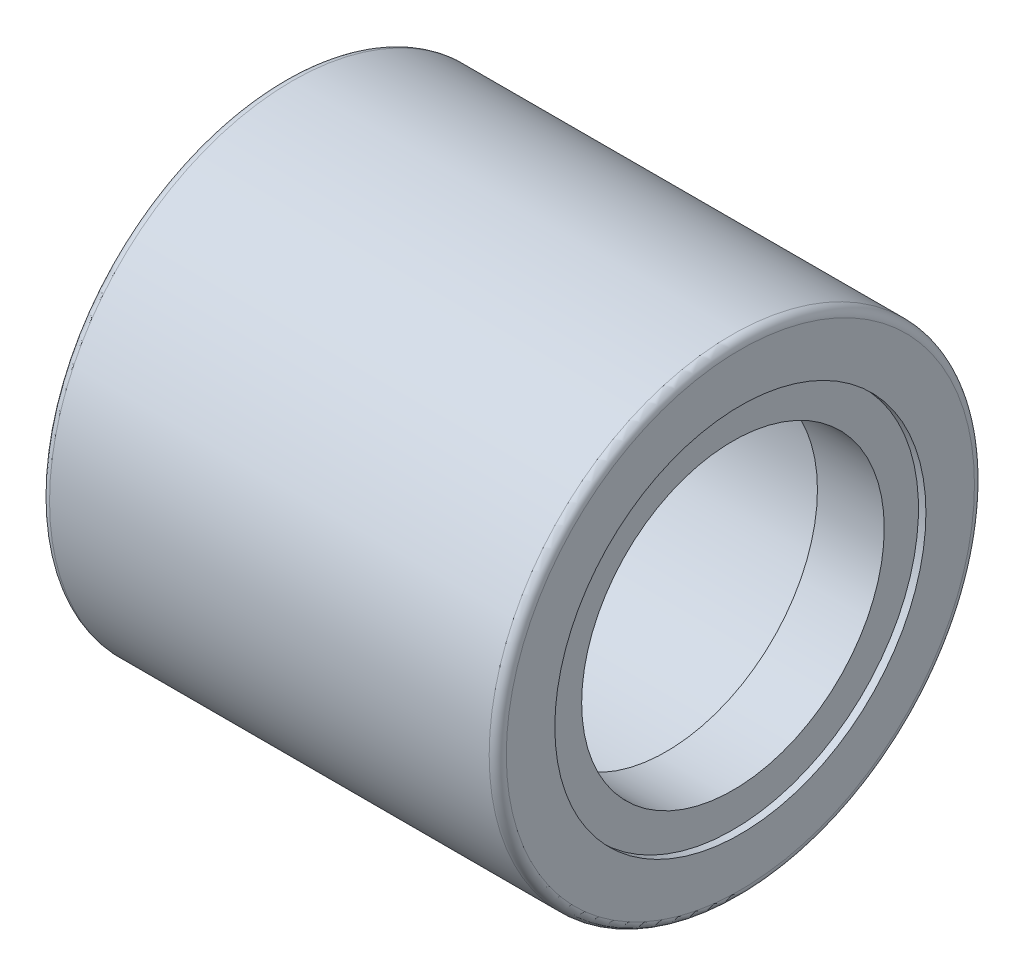
ISO-10303-21;
HEADER;
FILE_DESCRIPTION(('STEP AP214'),'2;1');
FILE_NAME('part.step','',(''),(''),'','','');
FILE_SCHEMA(('AUTOMOTIVE_DESIGN { 1 0 10303 214 1 1 1 1 }'));
ENDSEC;
DATA;
#1=APPLICATION_CONTEXT('core data for automotive mechanical design processes');
#2=APPLICATION_PROTOCOL_DEFINITION('international standard','automotive_design',2000,#1);
#3=PRODUCT_CONTEXT('',#1,'mechanical');
#4=PRODUCT('Part','Part','',(#3));
#5=PRODUCT_RELATED_PRODUCT_CATEGORY('part','',(#4));
#6=PRODUCT_DEFINITION_FORMATION('','',#4);
#7=PRODUCT_DEFINITION_CONTEXT('part definition',#1,'design');
#8=PRODUCT_DEFINITION('design','',#6,#7);
#9=PRODUCT_DEFINITION_SHAPE('','',#8);
#10=(LENGTH_UNIT() NAMED_UNIT(*) SI_UNIT(.MILLI.,.METRE.));
#11=(NAMED_UNIT(*) PLANE_ANGLE_UNIT() SI_UNIT($,.RADIAN.));
#12=(NAMED_UNIT(*) SI_UNIT($,.STERADIAN.) SOLID_ANGLE_UNIT());
#13=UNCERTAINTY_MEASURE_WITH_UNIT(LENGTH_MEASURE(1.E-05),#10,'distance_accuracy_value','');
#14=(GEOMETRIC_REPRESENTATION_CONTEXT(3) GLOBAL_UNCERTAINTY_ASSIGNED_CONTEXT((#13)) GLOBAL_UNIT_ASSIGNED_CONTEXT((#10,
#11,#12)) REPRESENTATION_CONTEXT('',''));
#15=CARTESIAN_POINT('',(0.,0.,0.));
#16=DIRECTION('',(0.,0.,1.));
#17=DIRECTION('',(1.,0.,0.));
#18=AXIS2_PLACEMENT_3D('',#15,#16,#17);
#19=CARTESIAN_POINT('',(0.,-8.42405645280223,-8.2));
#20=DIRECTION('',(-1.,0.,0.));
#21=DIRECTION('',(0.,0.,1.));
#22=AXIS2_PLACEMENT_3D('',#19,#20,#21);
#23=PLANE('',#22);
#24=CARTESIAN_POINT('',(0.,0.,0.));
#25=DIRECTION('',(-1.,0.,0.));
#26=DIRECTION('',(0.,0.,-1.));
#27=AXIS2_PLACEMENT_3D('',#24,#25,#26);
#28=CIRCLE('',#27,8.2);
#29=CARTESIAN_POINT('',(0.,0.,-8.2));
#30=VERTEX_POINT('',#29);
#31=EDGE_CURVE('E62',#30,#30,#28,.F.);
#32=ORIENTED_EDGE('',*,*,#31,.F.);
#33=EDGE_LOOP('',(#32));
#34=FACE_BOUND('',#33,.T.);
#35=CARTESIAN_POINT('',(0.,0.,0.));
#36=DIRECTION('',(1.,0.,0.));
#37=DIRECTION('',(0.,0.,1.));
#38=AXIS2_PLACEMENT_3D('',#35,#36,#37);
#39=CIRCLE('',#38,6.5);
#40=CARTESIAN_POINT('',(0.,0.,6.5));
#41=VERTEX_POINT('',#40);
#42=EDGE_CURVE('E59',#41,#41,#39,.T.);
#43=ORIENTED_EDGE('',*,*,#42,.T.);
#44=EDGE_LOOP('',(#43));
#45=FACE_BOUND('',#44,.T.);
#46=ADVANCED_FACE('F15',(#34,#45),#23,.T.);
#47=CARTESIAN_POINT('',(16.,-8.42405645280222,8.2));
#48=DIRECTION('',(1.,0.,0.));
#49=DIRECTION('',(0.,0.,-1.));
#50=AXIS2_PLACEMENT_3D('',#47,#48,#49);
#51=PLANE('',#50);
#52=CARTESIAN_POINT('',(16.,0.,0.));
#53=DIRECTION('',(1.,0.,0.));
#54=DIRECTION('',(0.,0.,1.));
#55=AXIS2_PLACEMENT_3D('',#52,#53,#54);
#56=CIRCLE('',#55,8.2);
#57=CARTESIAN_POINT('',(16.,0.,8.2));
#58=VERTEX_POINT('',#57);
#59=EDGE_CURVE('E56',#58,#58,#56,.T.);
#60=ORIENTED_EDGE('',*,*,#59,.T.);
#61=EDGE_LOOP('',(#60));
#62=FACE_BOUND('',#61,.T.);
#63=CARTESIAN_POINT('',(16.,0.,0.));
#64=DIRECTION('',(-1.,0.,0.));
#65=DIRECTION('',(0.,0.,-1.));
#66=AXIS2_PLACEMENT_3D('',#63,#64,#65);
#67=CIRCLE('',#66,6.5);
#68=CARTESIAN_POINT('',(16.,0.,-6.5));
#69=VERTEX_POINT('',#68);
#70=EDGE_CURVE('E53',#69,#69,#67,.F.);
#71=ORIENTED_EDGE('',*,*,#70,.F.);
#72=EDGE_LOOP('',(#71));
#73=FACE_BOUND('',#72,.T.);
#74=ADVANCED_FACE('F71',(#62,#73),#51,.T.);
#75=CARTESIAN_POINT('',(0.26,-6.67760572478225,-6.5));
#76=DIRECTION('',(-1.,0.,0.));
#77=DIRECTION('',(0.,0.,1.));
#78=AXIS2_PLACEMENT_3D('',#75,#76,#77);
#79=PLANE('',#78);
#80=CARTESIAN_POINT('',(0.26,0.,0.));
#81=DIRECTION('',(-1.,0.,0.));
#82=DIRECTION('',(0.,0.,-1.));
#83=AXIS2_PLACEMENT_3D('',#80,#81,#82);
#84=CIRCLE('',#83,6.5);
#85=CARTESIAN_POINT('',(0.26,0.,-6.5));
#86=VERTEX_POINT('',#85);
#87=EDGE_CURVE('E50',#86,#86,#84,.F.);
#88=ORIENTED_EDGE('',*,*,#87,.F.);
#89=EDGE_LOOP('',(#88));
#90=FACE_BOUND('',#89,.T.);
#91=CARTESIAN_POINT('',(0.26,0.,0.));
#92=DIRECTION('',(1.,0.,0.));
#93=DIRECTION('',(0.,0.,1.));
#94=AXIS2_PLACEMENT_3D('',#91,#92,#93);
#95=CIRCLE('',#94,5.3);
#96=CARTESIAN_POINT('',(0.26,0.,5.3));
#97=VERTEX_POINT('',#96);
#98=EDGE_CURVE('E47',#97,#97,#95,.T.);
#99=ORIENTED_EDGE('',*,*,#98,.T.);
#100=EDGE_LOOP('',(#99));
#101=FACE_BOUND('',#100,.T.);
#102=ADVANCED_FACE('F111',(#90,#101),#79,.T.);
#103=CARTESIAN_POINT('',(2.6,-6.67760572478225,6.5));
#104=DIRECTION('',(1.,0.,0.));
#105=DIRECTION('',(0.,0.,-1.));
#106=AXIS2_PLACEMENT_3D('',#103,#104,#105);
#107=PLANE('',#106);
#108=CARTESIAN_POINT('',(2.6,0.,0.));
#109=DIRECTION('',(1.,0.,0.));
#110=DIRECTION('',(0.,0.,1.));
#111=AXIS2_PLACEMENT_3D('',#108,#109,#110);
#112=CIRCLE('',#111,6.5);
#113=CARTESIAN_POINT('',(2.6,0.,6.5));
#114=VERTEX_POINT('',#113);
#115=EDGE_CURVE('E44',#114,#114,#112,.T.);
#116=ORIENTED_EDGE('',*,*,#115,.T.);
#117=EDGE_LOOP('',(#116));
#118=FACE_BOUND('',#117,.T.);
#119=CARTESIAN_POINT('',(2.6,0.,0.));
#120=DIRECTION('',(-1.,0.,0.));
#121=DIRECTION('',(0.,0.,-1.));
#122=AXIS2_PLACEMENT_3D('',#119,#120,#121);
#123=CIRCLE('',#122,5.3);
#124=CARTESIAN_POINT('',(2.6,0.,-5.3));
#125=VERTEX_POINT('',#124);
#126=EDGE_CURVE('E41',#125,#125,#123,.F.);
#127=ORIENTED_EDGE('',*,*,#126,.F.);
#128=EDGE_LOOP('',(#127));
#129=FACE_BOUND('',#128,.T.);
#130=ADVANCED_FACE('F113',(#118,#129),#107,.T.);
#131=CARTESIAN_POINT('',(13.4,-6.67760572478225,-6.5));
#132=DIRECTION('',(-1.,0.,0.));
#133=DIRECTION('',(0.,0.,1.));
#134=AXIS2_PLACEMENT_3D('',#131,#132,#133);
#135=PLANE('',#134);
#136=CARTESIAN_POINT('',(13.4,0.,0.));
#137=DIRECTION('',(-1.,0.,0.));
#138=DIRECTION('',(0.,0.,-1.));
#139=AXIS2_PLACEMENT_3D('',#136,#137,#138);
#140=CIRCLE('',#139,6.5);
#141=CARTESIAN_POINT('',(13.4,0.,-6.5));
#142=VERTEX_POINT('',#141);
#143=EDGE_CURVE('E38',#142,#142,#140,.F.);
#144=ORIENTED_EDGE('',*,*,#143,.F.);
#145=EDGE_LOOP('',(#144));
#146=FACE_BOUND('',#145,.T.);
#147=CARTESIAN_POINT('',(13.4,0.,0.));
#148=DIRECTION('',(1.,0.,0.));
#149=DIRECTION('',(0.,0.,1.));
#150=AXIS2_PLACEMENT_3D('',#147,#148,#149);
#151=CIRCLE('',#150,5.3);
#152=CARTESIAN_POINT('',(13.4,0.,5.3));
#153=VERTEX_POINT('',#152);
#154=EDGE_CURVE('E35',#153,#153,#151,.T.);
#155=ORIENTED_EDGE('',*,*,#154,.T.);
#156=EDGE_LOOP('',(#155));
#157=FACE_BOUND('',#156,.T.);
#158=ADVANCED_FACE('F120',(#146,#157),#135,.T.);
#159=CARTESIAN_POINT('',(15.74,-6.67760572478225,6.5));
#160=DIRECTION('',(1.,0.,0.));
#161=DIRECTION('',(0.,0.,-1.));
#162=AXIS2_PLACEMENT_3D('',#159,#160,#161);
#163=PLANE('',#162);
#164=CARTESIAN_POINT('',(15.74,0.,0.));
#165=DIRECTION('',(1.,0.,0.));
#166=DIRECTION('',(0.,0.,1.));
#167=AXIS2_PLACEMENT_3D('',#164,#165,#166);
#168=CIRCLE('',#167,6.5);
#169=CARTESIAN_POINT('',(15.74,0.,6.5));
#170=VERTEX_POINT('',#169);
#171=EDGE_CURVE('E30',#170,#170,#168,.T.);
#172=ORIENTED_EDGE('',*,*,#171,.T.);
#173=EDGE_LOOP('',(#172));
#174=FACE_BOUND('',#173,.T.);
#175=CARTESIAN_POINT('',(15.74,0.,0.));
#176=DIRECTION('',(-1.,0.,0.));
#177=DIRECTION('',(0.,0.,-1.));
#178=AXIS2_PLACEMENT_3D('',#175,#176,#177);
#179=CIRCLE('',#178,5.3);
#180=CARTESIAN_POINT('',(15.74,0.,-5.3));
#181=VERTEX_POINT('',#180);
#182=EDGE_CURVE('E26',#181,#181,#179,.F.);
#183=ORIENTED_EDGE('',*,*,#182,.F.);
#184=EDGE_LOOP('',(#183));
#185=FACE_BOUND('',#184,.T.);
#186=ADVANCED_FACE('F87',(#174,#185),#163,.T.);
#187=CARTESIAN_POINT('',(50.,0.,0.));
#188=DIRECTION('',(1.,0.,0.));
#189=DIRECTION('',(0.,0.,1.));
#190=AXIS2_PLACEMENT_3D('',#187,#188,#189);
#191=CYLINDRICAL_SURFACE('',#190,6.5);
#192=ORIENTED_EDGE('',*,*,#143,.T.);
#193=EDGE_LOOP('',(#192));
#194=FACE_BOUND('',#193,.T.);
#195=ORIENTED_EDGE('',*,*,#115,.F.);
#196=EDGE_LOOP('',(#195));
#197=FACE_BOUND('',#196,.T.);
#198=ADVANCED_FACE('F77',(#194,#197),#191,.F.);
#199=CARTESIAN_POINT('',(50.,0.,0.));
#200=DIRECTION('',(1.,0.,0.));
#201=DIRECTION('',(0.,0.,1.));
#202=AXIS2_PLACEMENT_3D('',#199,#200,#201);
#203=CYLINDRICAL_SURFACE('',#202,6.5);
#204=ORIENTED_EDGE('',*,*,#87,.T.);
#205=EDGE_LOOP('',(#204));
#206=FACE_BOUND('',#205,.T.);
#207=ORIENTED_EDGE('',*,*,#42,.F.);
#208=EDGE_LOOP('',(#207));
#209=FACE_BOUND('',#208,.T.);
#210=ADVANCED_FACE('F75',(#206,#209),#203,.F.);
#211=CARTESIAN_POINT('',(0.29999999999994,0.,0.));
#212=DIRECTION('',(1.,0.,0.));
#213=DIRECTION('',(0.,1.92344929213359E-10,1.));
#214=AXIS2_PLACEMENT_3D('',#211,#212,#213);
#215=TOROIDAL_SURFACE('',#214,8.2,0.299999999999939);
#216=ORIENTED_EDGE('',*,*,#31,.T.);
#217=EDGE_LOOP('',(#216));
#218=FACE_BOUND('',#217,.T.);
#219=CARTESIAN_POINT('',(0.29999999999994,0.,0.));
#220=DIRECTION('',(-1.,0.,0.));
#221=DIRECTION('',(0.,0.,-1.));
#222=AXIS2_PLACEMENT_3D('',#219,#220,#221);
#223=CIRCLE('',#222,8.49999999999994);
#224=CARTESIAN_POINT('',(0.29999999999994,0.,-8.49999999999994));
#225=VERTEX_POINT('',#224);
#226=EDGE_CURVE('E22',#225,#225,#223,.F.);
#227=ORIENTED_EDGE('',*,*,#226,.F.);
#228=EDGE_LOOP('',(#227));
#229=FACE_BOUND('',#228,.T.);
#230=ADVANCED_FACE('F66',(#218,#229),#215,.T.);
#231=CARTESIAN_POINT('',(50.,0.,0.));
#232=DIRECTION('',(1.,0.,0.));
#233=DIRECTION('',(0.,0.,1.));
#234=AXIS2_PLACEMENT_3D('',#231,#232,#233);
#235=CYLINDRICAL_SURFACE('',#234,6.5);
#236=ORIENTED_EDGE('',*,*,#70,.T.);
#237=EDGE_LOOP('',(#236));
#238=FACE_BOUND('',#237,.T.);
#239=ORIENTED_EDGE('',*,*,#171,.F.);
#240=EDGE_LOOP('',(#239));
#241=FACE_BOUND('',#240,.T.);
#242=ADVANCED_FACE('F85',(#238,#241),#235,.F.);
#243=CARTESIAN_POINT('',(15.7,0.,0.));
#244=DIRECTION('',(1.,0.,0.));
#245=DIRECTION('',(0.,0.,1.));
#246=AXIS2_PLACEMENT_3D('',#243,#244,#245);
#247=TOROIDAL_SURFACE('',#246,8.20000000000012,0.29999999999988);
#248=CARTESIAN_POINT('',(15.7,0.,0.));
#249=DIRECTION('',(1.,0.,0.));
#250=DIRECTION('',(0.,0.,1.));
#251=AXIS2_PLACEMENT_3D('',#248,#249,#250);
#252=CIRCLE('',#251,8.5);
#253=CARTESIAN_POINT('',(15.7,0.,8.5));
#254=VERTEX_POINT('',#253);
#255=EDGE_CURVE('E10',#254,#254,#252,.T.);
#256=ORIENTED_EDGE('',*,*,#255,.T.);
#257=EDGE_LOOP('',(#256));
#258=FACE_BOUND('',#257,.T.);
#259=ORIENTED_EDGE('',*,*,#59,.F.);
#260=EDGE_LOOP('',(#259));
#261=FACE_BOUND('',#260,.T.);
#262=ADVANCED_FACE('F94',(#258,#261),#247,.T.);
#263=CARTESIAN_POINT('',(50.,0.,0.));
#264=DIRECTION('',(1.,0.,0.));
#265=DIRECTION('',(0.,1.92344929213359E-10,1.));
#266=AXIS2_PLACEMENT_3D('',#263,#264,#265);
#267=CYLINDRICAL_SURFACE('',#266,8.5);
#268=ORIENTED_EDGE('',*,*,#226,.T.);
#269=EDGE_LOOP('',(#268));
#270=FACE_BOUND('',#269,.T.);
#271=ORIENTED_EDGE('',*,*,#255,.F.);
#272=EDGE_LOOP('',(#271));
#273=FACE_BOUND('',#272,.T.);
#274=ADVANCED_FACE('F98',(#270,#273),#267,.T.);
#275=CARTESIAN_POINT('',(50.,0.,0.));
#276=DIRECTION('',(1.,0.,0.));
#277=DIRECTION('',(0.,0.,1.));
#278=AXIS2_PLACEMENT_3D('',#275,#276,#277);
#279=CYLINDRICAL_SURFACE('',#278,5.3);
#280=ORIENTED_EDGE('',*,*,#126,.T.);
#281=EDGE_LOOP('',(#280));
#282=FACE_BOUND('',#281,.T.);
#283=ORIENTED_EDGE('',*,*,#98,.F.);
#284=EDGE_LOOP('',(#283));
#285=FACE_BOUND('',#284,.T.);
#286=ADVANCED_FACE('F100',(#282,#285),#279,.F.);
#287=CARTESIAN_POINT('',(50.,0.,0.));
#288=DIRECTION('',(1.,0.,0.));
#289=DIRECTION('',(0.,0.,1.));
#290=AXIS2_PLACEMENT_3D('',#287,#288,#289);
#291=CYLINDRICAL_SURFACE('',#290,5.3);
#292=ORIENTED_EDGE('',*,*,#182,.T.);
#293=EDGE_LOOP('',(#292));
#294=FACE_BOUND('',#293,.T.);
#295=ORIENTED_EDGE('',*,*,#154,.F.);
#296=EDGE_LOOP('',(#295));
#297=FACE_BOUND('',#296,.T.);
#298=ADVANCED_FACE('F17',(#294,#297),#291,.F.);
#299=CLOSED_SHELL('',(#46,#74,#102,#130,#158,#186,#198,#210,#230,#242,#262,#274,#286,#298));
#300=MANIFOLD_SOLID_BREP('B1',#299);
#301=ADVANCED_BREP_SHAPE_REPRESENTATION('',(#18,#300),#14);
#302=SHAPE_DEFINITION_REPRESENTATION(#9,#301);
ENDSEC;
END-ISO-10303-21;
